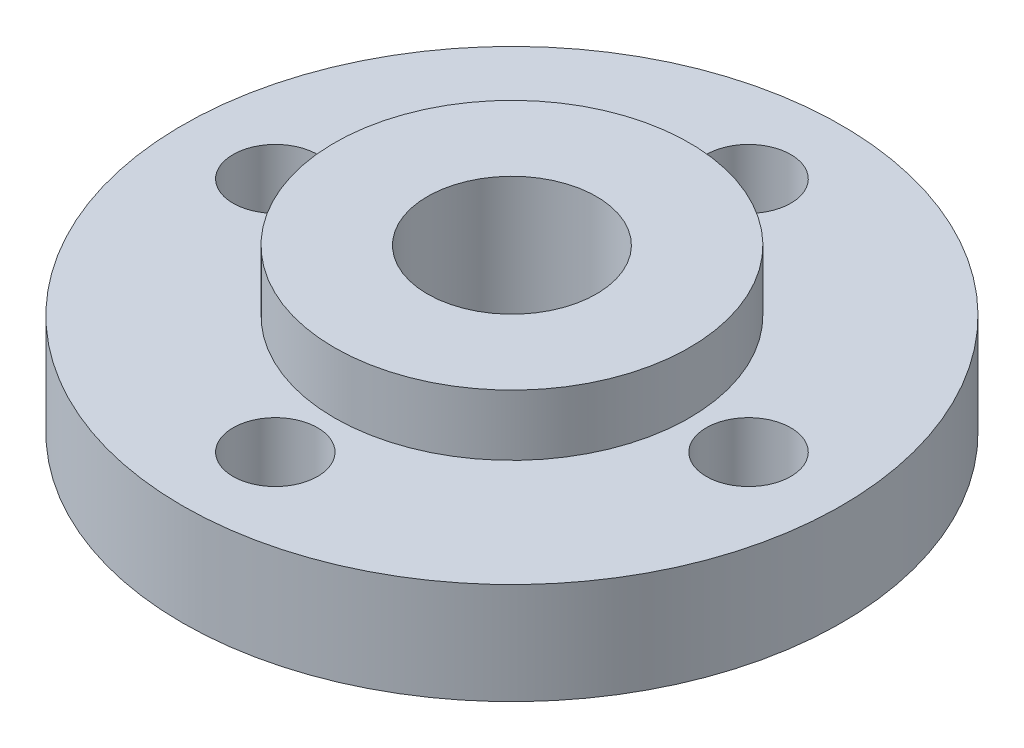
ISO-10303-21;
HEADER;
FILE_DESCRIPTION(('STEP AP214'),'2;1');
FILE_NAME('part.step','',(''),(''),'','','');
FILE_SCHEMA(('AUTOMOTIVE_DESIGN { 1 0 10303 214 1 1 1 1 }'));
ENDSEC;
DATA;
#1=APPLICATION_CONTEXT('core data for automotive mechanical design processes');
#2=APPLICATION_PROTOCOL_DEFINITION('international standard','automotive_design',2000,#1);
#3=PRODUCT_CONTEXT('',#1,'mechanical');
#4=PRODUCT('Part','Part','',(#3));
#5=PRODUCT_RELATED_PRODUCT_CATEGORY('part','',(#4));
#6=PRODUCT_DEFINITION_FORMATION('','',#4);
#7=PRODUCT_DEFINITION_CONTEXT('part definition',#1,'design');
#8=PRODUCT_DEFINITION('design','',#6,#7);
#9=PRODUCT_DEFINITION_SHAPE('','',#8);
#10=(LENGTH_UNIT() NAMED_UNIT(*) SI_UNIT(.MILLI.,.METRE.));
#11=(NAMED_UNIT(*) PLANE_ANGLE_UNIT() SI_UNIT($,.RADIAN.));
#12=(NAMED_UNIT(*) SI_UNIT($,.STERADIAN.) SOLID_ANGLE_UNIT());
#13=UNCERTAINTY_MEASURE_WITH_UNIT(LENGTH_MEASURE(1.E-05),#10,'distance_accuracy_value','');
#14=(GEOMETRIC_REPRESENTATION_CONTEXT(3) GLOBAL_UNCERTAINTY_ASSIGNED_CONTEXT((#13)) GLOBAL_UNIT_ASSIGNED_CONTEXT((#10,
#11,#12)) REPRESENTATION_CONTEXT('',''));
#15=CARTESIAN_POINT('',(0.,0.,0.));
#16=DIRECTION('',(0.,0.,1.));
#17=DIRECTION('',(1.,0.,0.));
#18=AXIS2_PLACEMENT_3D('',#15,#16,#17);
#19=CARTESIAN_POINT('',(0.,3.,0.));
#20=DIRECTION('',(0.,1.,0.));
#21=DIRECTION('',(0.,0.,1.));
#22=AXIS2_PLACEMENT_3D('',#19,#20,#21);
#23=PLANE('',#22);
#24=CARTESIAN_POINT('',(0.,3.,-7.));
#25=DIRECTION('',(0.,1.,0.));
#26=DIRECTION('',(0.,0.,1.));
#27=AXIS2_PLACEMENT_3D('',#24,#25,#26);
#28=CIRCLE('',#27,1.24999999999999);
#29=CARTESIAN_POINT('',(0.,3.,-5.75000000000001));
#30=VERTEX_POINT('',#29);
#31=EDGE_CURVE('E79',#30,#30,#28,.T.);
#32=ORIENTED_EDGE('',*,*,#31,.F.);
#33=EDGE_LOOP('',(#32));
#34=FACE_BOUND('',#33,.T.);
#35=CARTESIAN_POINT('',(7.,3.,0.));
#36=DIRECTION('',(0.,1.,0.));
#37=DIRECTION('',(0.,0.,1.));
#38=AXIS2_PLACEMENT_3D('',#35,#36,#37);
#39=CIRCLE('',#38,1.24999999999999);
#40=CARTESIAN_POINT('',(7.,3.,1.24999999999999));
#41=VERTEX_POINT('',#40);
#42=EDGE_CURVE('E73',#41,#41,#39,.T.);
#43=ORIENTED_EDGE('',*,*,#42,.F.);
#44=EDGE_LOOP('',(#43));
#45=FACE_BOUND('',#44,.T.);
#46=CARTESIAN_POINT('',(0.,3.,7.));
#47=DIRECTION('',(0.,1.,0.));
#48=DIRECTION('',(0.,0.,1.));
#49=AXIS2_PLACEMENT_3D('',#46,#47,#48);
#50=CIRCLE('',#49,1.24999999999999);
#51=CARTESIAN_POINT('',(0.,3.,8.24999999999999));
#52=VERTEX_POINT('',#51);
#53=EDGE_CURVE('E67',#52,#52,#50,.T.);
#54=ORIENTED_EDGE('',*,*,#53,.F.);
#55=EDGE_LOOP('',(#54));
#56=FACE_BOUND('',#55,.T.);
#57=CARTESIAN_POINT('',(-7.,3.,0.));
#58=DIRECTION('',(0.,1.,0.));
#59=DIRECTION('',(0.,0.,1.));
#60=AXIS2_PLACEMENT_3D('',#57,#58,#59);
#61=CIRCLE('',#60,1.24999999999999);
#62=CARTESIAN_POINT('',(-7.,3.,1.24999999999999));
#63=VERTEX_POINT('',#62);
#64=EDGE_CURVE('E61',#63,#63,#61,.T.);
#65=ORIENTED_EDGE('',*,*,#64,.F.);
#66=EDGE_LOOP('',(#65));
#67=FACE_BOUND('',#66,.T.);
#68=CARTESIAN_POINT('',(0.,3.,0.));
#69=DIRECTION('',(0.,1.,0.));
#70=DIRECTION('',(0.,0.,1.));
#71=AXIS2_PLACEMENT_3D('',#68,#69,#70);
#72=CIRCLE('',#71,9.75);
#73=CARTESIAN_POINT('',(0.,3.,9.75));
#74=VERTEX_POINT('',#73);
#75=EDGE_CURVE('E10',#74,#74,#72,.T.);
#76=ORIENTED_EDGE('',*,*,#75,.T.);
#77=EDGE_LOOP('',(#76));
#78=FACE_BOUND('',#77,.T.);
#79=CARTESIAN_POINT('',(0.,3.,0.));
#80=DIRECTION('',(0.,1.,0.));
#81=DIRECTION('',(0.,0.,1.));
#82=AXIS2_PLACEMENT_3D('',#79,#80,#81);
#83=CIRCLE('',#82,5.25);
#84=CARTESIAN_POINT('',(0.,3.,5.25));
#85=VERTEX_POINT('',#84);
#86=EDGE_CURVE('E47',#85,#85,#83,.T.);
#87=ORIENTED_EDGE('',*,*,#86,.F.);
#88=EDGE_LOOP('',(#87));
#89=FACE_BOUND('',#88,.T.);
#90=ADVANCED_FACE('F34',(#34,#45,#56,#67,#78,#89),#23,.T.);
#91=CARTESIAN_POINT('',(0.,3.,0.));
#92=DIRECTION('',(0.,-1.,0.));
#93=DIRECTION('',(0.,0.,-1.));
#94=AXIS2_PLACEMENT_3D('',#91,#92,#93);
#95=CYLINDRICAL_SURFACE('',#94,9.75);
#96=ORIENTED_EDGE('',*,*,#75,.F.);
#97=EDGE_LOOP('',(#96));
#98=FACE_BOUND('',#97,.T.);
#99=CARTESIAN_POINT('',(0.,0.,0.));
#100=DIRECTION('',(0.,1.,0.));
#101=DIRECTION('',(0.,0.,1.));
#102=AXIS2_PLACEMENT_3D('',#99,#100,#101);
#103=CIRCLE('',#102,9.75);
#104=CARTESIAN_POINT('',(0.,0.,9.75));
#105=VERTEX_POINT('',#104);
#106=EDGE_CURVE('E38',#105,#105,#103,.T.);
#107=ORIENTED_EDGE('',*,*,#106,.T.);
#108=EDGE_LOOP('',(#107));
#109=FACE_BOUND('',#108,.T.);
#110=ADVANCED_FACE('F36',(#98,#109),#95,.T.);
#111=CARTESIAN_POINT('',(0.,0.,0.));
#112=DIRECTION('',(0.,1.,0.));
#113=DIRECTION('',(0.,0.,1.));
#114=AXIS2_PLACEMENT_3D('',#111,#112,#113);
#115=PLANE('',#114);
#116=CARTESIAN_POINT('',(0.,0.,0.));
#117=DIRECTION('',(0.,1.,0.));
#118=DIRECTION('',(0.,0.,1.));
#119=AXIS2_PLACEMENT_3D('',#116,#117,#118);
#120=CIRCLE('',#119,1.5);
#121=CARTESIAN_POINT('',(0.,0.,1.5));
#122=VERTEX_POINT('',#121);
#123=EDGE_CURVE('E82',#122,#122,#120,.T.);
#124=ORIENTED_EDGE('',*,*,#123,.T.);
#125=EDGE_LOOP('',(#124));
#126=FACE_BOUND('',#125,.T.);
#127=CARTESIAN_POINT('',(0.,0.,-7.));
#128=DIRECTION('',(0.,1.,0.));
#129=DIRECTION('',(0.,0.,1.));
#130=AXIS2_PLACEMENT_3D('',#127,#128,#129);
#131=CIRCLE('',#130,1.24999999999999);
#132=CARTESIAN_POINT('',(0.,0.,-5.75000000000001));
#133=VERTEX_POINT('',#132);
#134=EDGE_CURVE('E76',#133,#133,#131,.T.);
#135=ORIENTED_EDGE('',*,*,#134,.T.);
#136=EDGE_LOOP('',(#135));
#137=FACE_BOUND('',#136,.T.);
#138=CARTESIAN_POINT('',(7.,0.,0.));
#139=DIRECTION('',(0.,1.,0.));
#140=DIRECTION('',(0.,0.,1.));
#141=AXIS2_PLACEMENT_3D('',#138,#139,#140);
#142=CIRCLE('',#141,1.24999999999999);
#143=CARTESIAN_POINT('',(7.,0.,1.24999999999999));
#144=VERTEX_POINT('',#143);
#145=EDGE_CURVE('E70',#144,#144,#142,.T.);
#146=ORIENTED_EDGE('',*,*,#145,.T.);
#147=EDGE_LOOP('',(#146));
#148=FACE_BOUND('',#147,.T.);
#149=CARTESIAN_POINT('',(0.,0.,7.));
#150=DIRECTION('',(0.,1.,0.));
#151=DIRECTION('',(0.,0.,1.));
#152=AXIS2_PLACEMENT_3D('',#149,#150,#151);
#153=CIRCLE('',#152,1.24999999999999);
#154=CARTESIAN_POINT('',(0.,0.,8.24999999999999));
#155=VERTEX_POINT('',#154);
#156=EDGE_CURVE('E64',#155,#155,#153,.T.);
#157=ORIENTED_EDGE('',*,*,#156,.T.);
#158=EDGE_LOOP('',(#157));
#159=FACE_BOUND('',#158,.T.);
#160=CARTESIAN_POINT('',(-7.,0.,0.));
#161=DIRECTION('',(0.,1.,0.));
#162=DIRECTION('',(0.,0.,1.));
#163=AXIS2_PLACEMENT_3D('',#160,#161,#162);
#164=CIRCLE('',#163,1.24999999999999);
#165=CARTESIAN_POINT('',(-7.,0.,1.24999999999999));
#166=VERTEX_POINT('',#165);
#167=EDGE_CURVE('E56',#166,#166,#164,.T.);
#168=ORIENTED_EDGE('',*,*,#167,.T.);
#169=EDGE_LOOP('',(#168));
#170=FACE_BOUND('',#169,.T.);
#171=ORIENTED_EDGE('',*,*,#106,.F.);
#172=EDGE_LOOP('',(#171));
#173=FACE_BOUND('',#172,.T.);
#174=ADVANCED_FACE('F114',(#126,#137,#148,#159,#170,#173),#115,.F.);
#175=CARTESIAN_POINT('',(0.,4.8,0.));
#176=DIRECTION('',(0.,-1.,0.));
#177=DIRECTION('',(0.,0.,-1.));
#178=AXIS2_PLACEMENT_3D('',#175,#176,#177);
#179=CYLINDRICAL_SURFACE('',#178,5.25);
#180=CARTESIAN_POINT('',(0.,4.8,0.));
#181=DIRECTION('',(0.,1.,0.));
#182=DIRECTION('',(0.,0.,1.));
#183=AXIS2_PLACEMENT_3D('',#180,#181,#182);
#184=CIRCLE('',#183,5.25);
#185=CARTESIAN_POINT('',(0.,4.8,5.25));
#186=VERTEX_POINT('',#185);
#187=EDGE_CURVE('E45',#186,#186,#184,.T.);
#188=ORIENTED_EDGE('',*,*,#187,.F.);
#189=EDGE_LOOP('',(#188));
#190=FACE_BOUND('',#189,.T.);
#191=ORIENTED_EDGE('',*,*,#86,.T.);
#192=EDGE_LOOP('',(#191));
#193=FACE_BOUND('',#192,.T.);
#194=ADVANCED_FACE('F108',(#190,#193),#179,.T.);
#195=CARTESIAN_POINT('',(0.,4.8,0.));
#196=DIRECTION('',(0.,1.,0.));
#197=DIRECTION('',(0.,0.,1.));
#198=AXIS2_PLACEMENT_3D('',#195,#196,#197);
#199=PLANE('',#198);
#200=CARTESIAN_POINT('',(0.,4.8,0.));
#201=DIRECTION('',(0.,1.,0.));
#202=DIRECTION('',(0.,0.,1.));
#203=AXIS2_PLACEMENT_3D('',#200,#201,#202);
#204=CIRCLE('',#203,2.5);
#205=CARTESIAN_POINT('',(0.,4.8,2.5));
#206=VERTEX_POINT('',#205);
#207=EDGE_CURVE('E53',#206,#206,#204,.T.);
#208=ORIENTED_EDGE('',*,*,#207,.F.);
#209=EDGE_LOOP('',(#208));
#210=FACE_BOUND('',#209,.T.);
#211=ORIENTED_EDGE('',*,*,#187,.T.);
#212=EDGE_LOOP('',(#211));
#213=FACE_BOUND('',#212,.T.);
#214=ADVANCED_FACE('F102',(#210,#213),#199,.T.);
#215=CARTESIAN_POINT('',(0.,1.1,0.));
#216=DIRECTION('',(0.,1.,0.));
#217=DIRECTION('',(0.,0.,1.));
#218=AXIS2_PLACEMENT_3D('',#215,#216,#217);
#219=CYLINDRICAL_SURFACE('',#218,2.5);
#220=CARTESIAN_POINT('',(0.,1.1,0.));
#221=DIRECTION('',(0.,1.,0.));
#222=DIRECTION('',(0.,0.,1.));
#223=AXIS2_PLACEMENT_3D('',#220,#221,#222);
#224=CIRCLE('',#223,2.5);
#225=CARTESIAN_POINT('',(0.,1.1,2.5));
#226=VERTEX_POINT('',#225);
#227=EDGE_CURVE('E50',#226,#226,#224,.T.);
#228=ORIENTED_EDGE('',*,*,#227,.F.);
#229=EDGE_LOOP('',(#228));
#230=FACE_BOUND('',#229,.T.);
#231=ORIENTED_EDGE('',*,*,#207,.T.);
#232=EDGE_LOOP('',(#231));
#233=FACE_BOUND('',#232,.T.);
#234=ADVANCED_FACE('F96',(#230,#233),#219,.F.);
#235=CARTESIAN_POINT('',(0.,1.1,0.));
#236=DIRECTION('',(0.,1.,0.));
#237=DIRECTION('',(0.,0.,1.));
#238=AXIS2_PLACEMENT_3D('',#235,#236,#237);
#239=PLANE('',#238);
#240=CARTESIAN_POINT('',(0.,1.1,0.));
#241=DIRECTION('',(0.,1.,0.));
#242=DIRECTION('',(0.,0.,1.));
#243=AXIS2_PLACEMENT_3D('',#240,#241,#242);
#244=CIRCLE('',#243,1.5);
#245=CARTESIAN_POINT('',(0.,1.1,1.5));
#246=VERTEX_POINT('',#245);
#247=EDGE_CURVE('E85',#246,#246,#244,.T.);
#248=ORIENTED_EDGE('',*,*,#247,.F.);
#249=EDGE_LOOP('',(#248));
#250=FACE_BOUND('',#249,.T.);
#251=ORIENTED_EDGE('',*,*,#227,.T.);
#252=EDGE_LOOP('',(#251));
#253=FACE_BOUND('',#252,.T.);
#254=ADVANCED_FACE('F92',(#250,#253),#239,.T.);
#255=CARTESIAN_POINT('',(-7.,3.,0.));
#256=DIRECTION('',(0.,1.,0.));
#257=DIRECTION('',(0.,0.,1.));
#258=AXIS2_PLACEMENT_3D('',#255,#256,#257);
#259=CYLINDRICAL_SURFACE('',#258,1.24999999999999);
#260=ORIENTED_EDGE('',*,*,#64,.T.);
#261=EDGE_LOOP('',(#260));
#262=FACE_BOUND('',#261,.T.);
#263=ORIENTED_EDGE('',*,*,#167,.F.);
#264=EDGE_LOOP('',(#263));
#265=FACE_BOUND('',#264,.T.);
#266=ADVANCED_FACE('F95',(#262,#265),#259,.F.);
#267=CARTESIAN_POINT('',(0.,3.,7.));
#268=DIRECTION('',(0.,1.,0.));
#269=DIRECTION('',(0.,0.,1.));
#270=AXIS2_PLACEMENT_3D('',#267,#268,#269);
#271=CYLINDRICAL_SURFACE('',#270,1.24999999999999);
#272=ORIENTED_EDGE('',*,*,#53,.T.);
#273=EDGE_LOOP('',(#272));
#274=FACE_BOUND('',#273,.T.);
#275=ORIENTED_EDGE('',*,*,#156,.F.);
#276=EDGE_LOOP('',(#275));
#277=FACE_BOUND('',#276,.T.);
#278=ADVANCED_FACE('F145',(#274,#277),#271,.F.);
#279=CARTESIAN_POINT('',(7.,3.,0.));
#280=DIRECTION('',(0.,1.,0.));
#281=DIRECTION('',(0.,0.,1.));
#282=AXIS2_PLACEMENT_3D('',#279,#280,#281);
#283=CYLINDRICAL_SURFACE('',#282,1.24999999999999);
#284=ORIENTED_EDGE('',*,*,#42,.T.);
#285=EDGE_LOOP('',(#284));
#286=FACE_BOUND('',#285,.T.);
#287=ORIENTED_EDGE('',*,*,#145,.F.);
#288=EDGE_LOOP('',(#287));
#289=FACE_BOUND('',#288,.T.);
#290=ADVANCED_FACE('F151',(#286,#289),#283,.F.);
#291=CARTESIAN_POINT('',(0.,3.,-7.));
#292=DIRECTION('',(0.,1.,0.));
#293=DIRECTION('',(0.,0.,1.));
#294=AXIS2_PLACEMENT_3D('',#291,#292,#293);
#295=CYLINDRICAL_SURFACE('',#294,1.24999999999999);
#296=ORIENTED_EDGE('',*,*,#31,.T.);
#297=EDGE_LOOP('',(#296));
#298=FACE_BOUND('',#297,.T.);
#299=ORIENTED_EDGE('',*,*,#134,.F.);
#300=EDGE_LOOP('',(#299));
#301=FACE_BOUND('',#300,.T.);
#302=ADVANCED_FACE('F157',(#298,#301),#295,.F.);
#303=CARTESIAN_POINT('',(0.,-2.6,0.));
#304=DIRECTION('',(0.,1.,0.));
#305=DIRECTION('',(0.,0.,1.));
#306=AXIS2_PLACEMENT_3D('',#303,#304,#305);
#307=CYLINDRICAL_SURFACE('',#306,1.5);
#308=ORIENTED_EDGE('',*,*,#247,.T.);
#309=EDGE_LOOP('',(#308));
#310=FACE_BOUND('',#309,.T.);
#311=ORIENTED_EDGE('',*,*,#123,.F.);
#312=EDGE_LOOP('',(#311));
#313=FACE_BOUND('',#312,.T.);
#314=ADVANCED_FACE('F89',(#310,#313),#307,.F.);
#315=CLOSED_SHELL('',(#90,#110,#174,#194,#214,#234,#254,#266,#278,#290,#302,#314));
#316=MANIFOLD_SOLID_BREP('B2',#315);
#317=ADVANCED_BREP_SHAPE_REPRESENTATION('',(#18,#316),#14);
#318=SHAPE_DEFINITION_REPRESENTATION(#9,#317);
ENDSEC;
END-ISO-10303-21;
